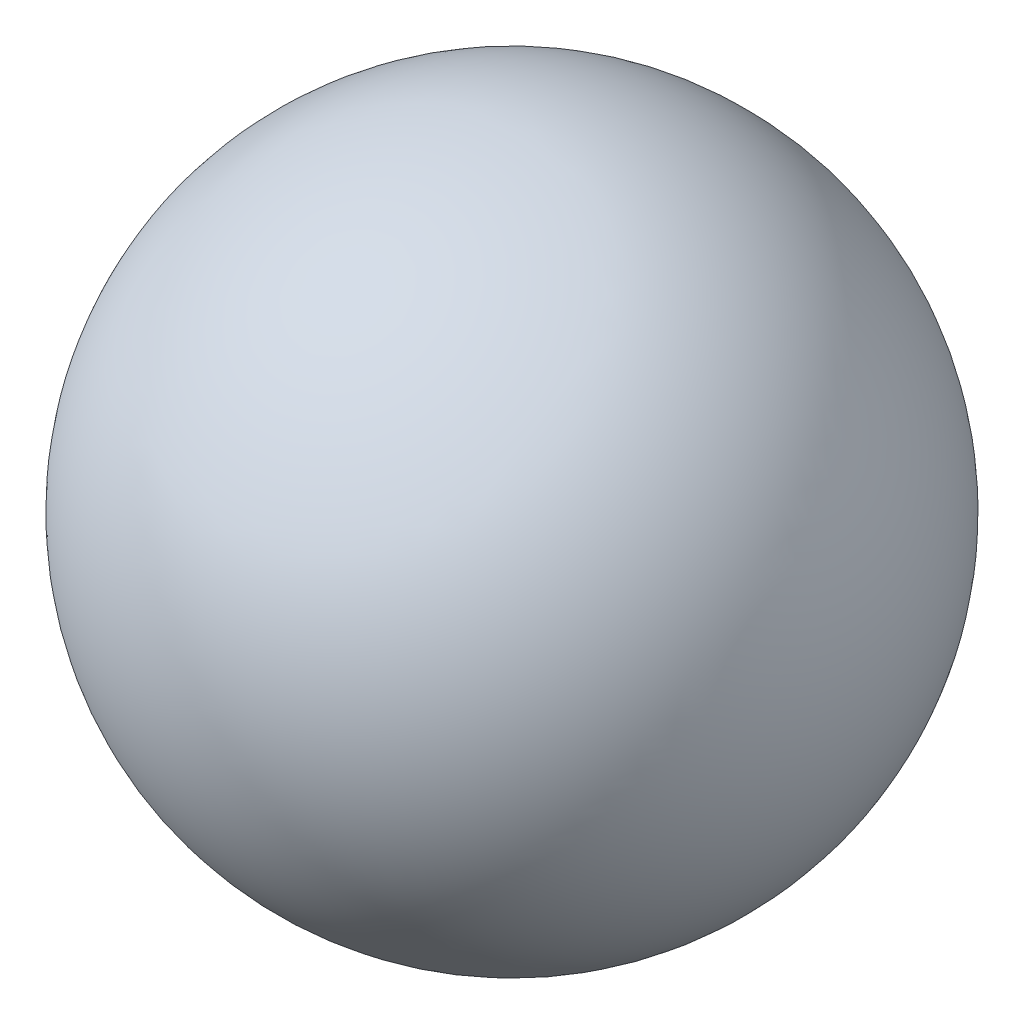
ISO-10303-21;
HEADER;
FILE_DESCRIPTION(('STEP AP214'),'2;1');
FILE_NAME('part.step','',(''),(''),'','','');
FILE_SCHEMA(('AUTOMOTIVE_DESIGN { 1 0 10303 214 1 1 1 1 }'));
ENDSEC;
DATA;
#1=APPLICATION_CONTEXT('core data for automotive mechanical design processes');
#2=APPLICATION_PROTOCOL_DEFINITION('international standard','automotive_design',2000,#1);
#3=PRODUCT_CONTEXT('',#1,'mechanical');
#4=PRODUCT('Part','Part','',(#3));
#5=PRODUCT_RELATED_PRODUCT_CATEGORY('part','',(#4));
#6=PRODUCT_DEFINITION_FORMATION('','',#4);
#7=PRODUCT_DEFINITION_CONTEXT('part definition',#1,'design');
#8=PRODUCT_DEFINITION('design','',#6,#7);
#9=PRODUCT_DEFINITION_SHAPE('','',#8);
#10=(LENGTH_UNIT() NAMED_UNIT(*) SI_UNIT(.MILLI.,.METRE.));
#11=(NAMED_UNIT(*) PLANE_ANGLE_UNIT() SI_UNIT($,.RADIAN.));
#12=(NAMED_UNIT(*) SI_UNIT($,.STERADIAN.) SOLID_ANGLE_UNIT());
#13=UNCERTAINTY_MEASURE_WITH_UNIT(LENGTH_MEASURE(1.E-05),#10,'distance_accuracy_value','');
#14=(GEOMETRIC_REPRESENTATION_CONTEXT(3) GLOBAL_UNCERTAINTY_ASSIGNED_CONTEXT((#13)) GLOBAL_UNIT_ASSIGNED_CONTEXT((#10,
#11,#12)) REPRESENTATION_CONTEXT('',''));
#15=CARTESIAN_POINT('',(0.,0.,0.));
#16=DIRECTION('',(0.,0.,1.));
#17=DIRECTION('',(1.,0.,0.));
#18=AXIS2_PLACEMENT_3D('',#15,#16,#17);
#19=CARTESIAN_POINT('',(0.,0.,0.));
#20=DIRECTION('',(-1.,0.,0.));
#21=DIRECTION('',(0.,1.,0.));
#22=AXIS2_PLACEMENT_3D('',#19,#20,#21);
#23=SPHERICAL_SURFACE('',#22,4.);
#24=CARTESIAN_POINT('',(-4.,0.,0.));
#25=VERTEX_POINT('',#24);
#26=VERTEX_LOOP('',#25);
#27=FACE_BOUND('',#26,.T.);
#28=ADVANCED_FACE('F28',(#27),#23,.T.);
#29=CLOSED_SHELL('',(#28));
#30=MANIFOLD_SOLID_BREP('B2',#29);
#31=ADVANCED_BREP_SHAPE_REPRESENTATION('',(#18,#30),#14);
#32=SHAPE_DEFINITION_REPRESENTATION(#9,#31);
ENDSEC;
END-ISO-10303-21;
